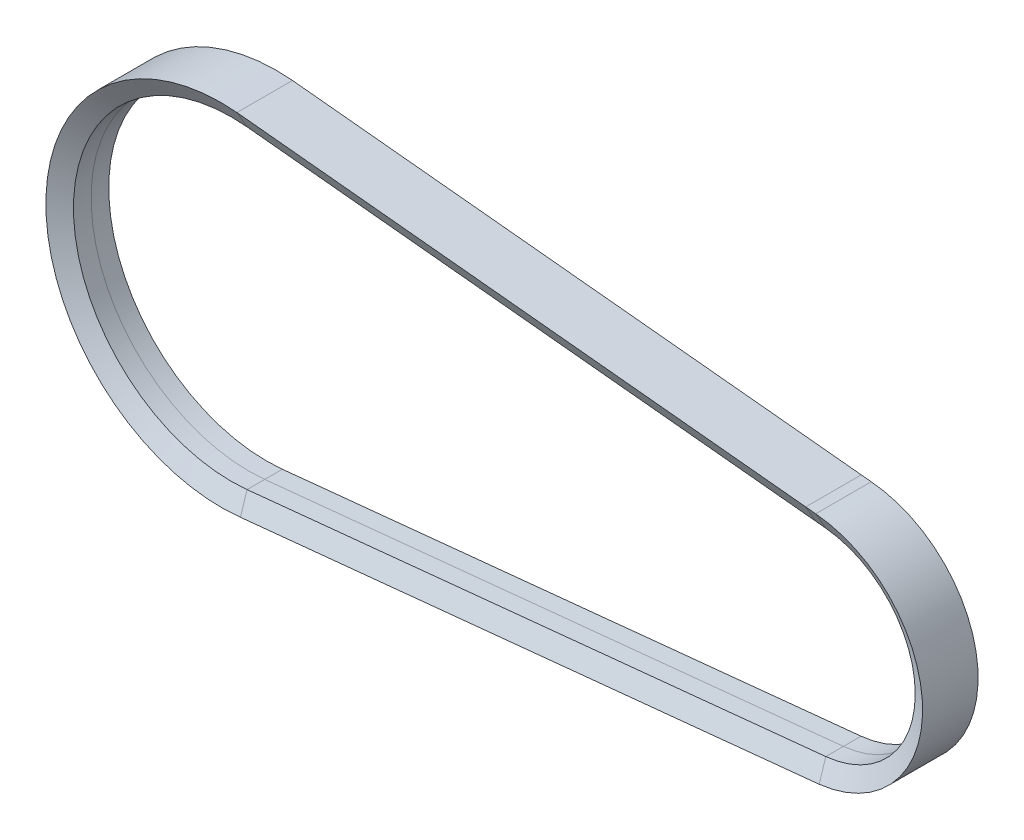
ISO-10303-21;
HEADER;
FILE_DESCRIPTION(('STEP AP214'),'2;1');
FILE_NAME('part.step','',(''),(''),'','','');
FILE_SCHEMA(('AUTOMOTIVE_DESIGN { 1 0 10303 214 1 1 1 1 }'));
ENDSEC;
DATA;
#1=APPLICATION_CONTEXT('core data for automotive mechanical design processes');
#2=APPLICATION_PROTOCOL_DEFINITION('international standard','automotive_design',2000,#1);
#3=PRODUCT_CONTEXT('',#1,'mechanical');
#4=PRODUCT('Part','Part','',(#3));
#5=PRODUCT_RELATED_PRODUCT_CATEGORY('part','',(#4));
#6=PRODUCT_DEFINITION_FORMATION('','',#4);
#7=PRODUCT_DEFINITION_CONTEXT('part definition',#1,'design');
#8=PRODUCT_DEFINITION('design','',#6,#7);
#9=PRODUCT_DEFINITION_SHAPE('','',#8);
#10=(LENGTH_UNIT() NAMED_UNIT(*) SI_UNIT(.MILLI.,.METRE.));
#11=(NAMED_UNIT(*) PLANE_ANGLE_UNIT() SI_UNIT($,.RADIAN.));
#12=(NAMED_UNIT(*) SI_UNIT($,.STERADIAN.) SOLID_ANGLE_UNIT());
#13=UNCERTAINTY_MEASURE_WITH_UNIT(LENGTH_MEASURE(1.E-05),#10,'distance_accuracy_value','');
#14=(GEOMETRIC_REPRESENTATION_CONTEXT(3) GLOBAL_UNCERTAINTY_ASSIGNED_CONTEXT((#13)) GLOBAL_UNIT_ASSIGNED_CONTEXT((#10,
#11,#12)) REPRESENTATION_CONTEXT('',''));
#15=CARTESIAN_POINT('',(0.,0.,0.));
#16=DIRECTION('',(0.,0.,1.));
#17=DIRECTION('',(1.,0.,0.));
#18=AXIS2_PLACEMENT_3D('',#15,#16,#17);
#19=CARTESIAN_POINT('',(-194.6,59.7293216037575,9.49910161513779));
#20=DIRECTION('',(-0.05018856132285,-0.499369880026909,0.864934003976172));
#21=DIRECTION('',(0.,-0.866025403784436,-0.500000000000004));
#22=AXIS2_PLACEMENT_3D('',#19,#20,#21);
#23=PLANE('',#22);
#24=DIRECTION('',(0.99498743710662,-0.1,0.));
#25=VECTOR('',#24,1.);
#26=CARTESIAN_POINT('',(-194.6,59.7293216037575,9.49910161513779));
#27=LINE('',#26,#25);
#28=CARTESIAN_POINT('',(-194.6,59.7293216037575,9.49910161513779));
#29=VERTEX_POINT('',#28);
#30=CARTESIAN_POINT('',(0.,40.1712857188132,9.49910161513779));
#31=VERTEX_POINT('',#30);
#32=EDGE_CURVE('E11',#29,#31,#27,.T.);
#33=ORIENTED_EDGE('',*,*,#32,.F.);
#34=DIRECTION('',(0.,-0.866025403784436,-0.500000000000004));
#35=VECTOR('',#34,1.);
#36=CARTESIAN_POINT('',(-194.6,59.7293216037575,9.49910161513779));
#37=LINE('',#36,#35);
#38=CARTESIAN_POINT('',(-194.6,53.7293216037575,6.035));
#39=VERTEX_POINT('',#38);
#40=EDGE_CURVE('E38',#29,#39,#37,.T.);
#41=ORIENTED_EDGE('',*,*,#40,.T.);
#42=DIRECTION('',(0.99498743710662,-0.1,0.));
#43=VECTOR('',#42,1.);
#44=CARTESIAN_POINT('',(-194.6,53.7293216037575,6.035));
#45=LINE('',#44,#43);
#46=CARTESIAN_POINT('',(0.,34.1712857188132,6.035));
#47=VERTEX_POINT('',#46);
#48=EDGE_CURVE('E163',#39,#47,#45,.T.);
#49=ORIENTED_EDGE('',*,*,#48,.T.);
#50=DIRECTION('',(0.,-0.866025403784436,-0.500000000000004));
#51=VECTOR('',#50,1.);
#52=CARTESIAN_POINT('',(0.,40.1712857188132,9.49910161513779));
#53=LINE('',#52,#51);
#54=EDGE_CURVE('E166',#31,#47,#53,.T.);
#55=ORIENTED_EDGE('',*,*,#54,.F.);
#56=EDGE_LOOP('',(#33,#41,#49,#55));
#57=FACE_BOUND('',#56,.T.);
#58=ADVANCED_FACE('F35',(#57),#23,.T.);
#59=CARTESIAN_POINT('',(-194.6,59.7293216037575,-9.4991016151378));
#60=DIRECTION('',(0.1,0.99498743710662,0.));
#61=DIRECTION('',(-0.99498743710662,0.1,0.));
#62=AXIS2_PLACEMENT_3D('',#59,#60,#61);
#63=PLANE('',#62);
#64=DIRECTION('',(0.99498743710662,-0.1,0.));
#65=VECTOR('',#64,1.);
#66=CARTESIAN_POINT('',(-194.6,59.7293216037575,-9.4991016151378));
#67=LINE('',#66,#65);
#68=CARTESIAN_POINT('',(-194.6,59.7293216037575,-9.4991016151378));
#69=VERTEX_POINT('',#68);
#70=CARTESIAN_POINT('',(0.,40.1712857188132,-9.4991016151378));
#71=VERTEX_POINT('',#70);
#72=EDGE_CURVE('E43',#69,#71,#67,.T.);
#73=ORIENTED_EDGE('',*,*,#72,.F.);
#74=DIRECTION('',(0.,0.,1.));
#75=VECTOR('',#74,1.);
#76=CARTESIAN_POINT('',(-194.6,59.7293216037575,-9.4991016151378));
#77=LINE('',#76,#75);
#78=EDGE_CURVE('E268',#69,#29,#77,.T.);
#79=ORIENTED_EDGE('',*,*,#78,.T.);
#80=ORIENTED_EDGE('',*,*,#32,.T.);
#81=DIRECTION('',(0.,0.,1.));
#82=VECTOR('',#81,1.);
#83=CARTESIAN_POINT('',(0.,40.1712857188132,-9.4991016151378));
#84=LINE('',#83,#82);
#85=EDGE_CURVE('E191',#71,#31,#84,.T.);
#86=ORIENTED_EDGE('',*,*,#85,.F.);
#87=EDGE_LOOP('',(#73,#79,#80,#86));
#88=FACE_BOUND('',#87,.T.);
#89=ADVANCED_FACE('F329',(#88),#63,.T.);
#90=CARTESIAN_POINT('',(-194.6,53.7293216037575,-6.035));
#91=DIRECTION('',(-0.0501885613228501,-0.49936988002691,-0.864934003976171));
#92=DIRECTION('',(0.,0.866025403784436,-0.500000000000005));
#93=AXIS2_PLACEMENT_3D('',#90,#91,#92);
#94=PLANE('',#93);
#95=DIRECTION('',(0.99498743710662,-0.1,0.));
#96=VECTOR('',#95,1.);
#97=CARTESIAN_POINT('',(-194.6,53.7293216037575,-6.035));
#98=LINE('',#97,#96);
#99=CARTESIAN_POINT('',(-194.6,53.7293216037575,-6.035));
#100=VERTEX_POINT('',#99);
#101=CARTESIAN_POINT('',(0.,34.1712857188132,-6.035));
#102=VERTEX_POINT('',#101);
#103=EDGE_CURVE('E232',#100,#102,#98,.T.);
#104=ORIENTED_EDGE('',*,*,#103,.F.);
#105=DIRECTION('',(0.,0.866025403784436,-0.500000000000005));
#106=VECTOR('',#105,1.);
#107=CARTESIAN_POINT('',(-194.6,53.7293216037575,-6.035));
#108=LINE('',#107,#106);
#109=EDGE_CURVE('E248',#100,#69,#108,.T.);
#110=ORIENTED_EDGE('',*,*,#109,.T.);
#111=ORIENTED_EDGE('',*,*,#72,.T.);
#112=DIRECTION('',(0.,0.866025403784436,-0.500000000000005));
#113=VECTOR('',#112,1.);
#114=CARTESIAN_POINT('',(0.,34.1712857188132,-6.035));
#115=LINE('',#114,#113);
#116=EDGE_CURVE('E199',#102,#71,#115,.T.);
#117=ORIENTED_EDGE('',*,*,#116,.F.);
#118=EDGE_LOOP('',(#104,#110,#111,#117));
#119=FACE_BOUND('',#118,.T.);
#120=ADVANCED_FACE('F333',(#119),#94,.T.);
#121=CARTESIAN_POINT('',(-194.6,53.7293216037575,0.));
#122=DIRECTION('',(-0.1,-0.99498743710662,0.));
#123=DIRECTION('',(0.99498743710662,-0.1,0.));
#124=AXIS2_PLACEMENT_3D('',#121,#122,#123);
#125=PLANE('',#124);
#126=DIRECTION('',(0.99498743710662,-0.1,0.));
#127=VECTOR('',#126,1.);
#128=CARTESIAN_POINT('',(-194.6,53.7293216037575,0.));
#129=LINE('',#128,#127);
#130=CARTESIAN_POINT('',(-194.6,53.7293216037575,0.));
#131=VERTEX_POINT('',#130);
#132=CARTESIAN_POINT('',(0.,34.1712857188132,0.));
#133=VERTEX_POINT('',#132);
#134=EDGE_CURVE('E172',#131,#133,#129,.T.);
#135=ORIENTED_EDGE('',*,*,#134,.F.);
#136=DIRECTION('',(0.,0.,-1.));
#137=VECTOR('',#136,1.);
#138=CARTESIAN_POINT('',(-194.6,53.7293216037575,0.));
#139=LINE('',#138,#137);
#140=EDGE_CURVE('E226',#131,#100,#139,.T.);
#141=ORIENTED_EDGE('',*,*,#140,.T.);
#142=ORIENTED_EDGE('',*,*,#103,.T.);
#143=DIRECTION('',(0.,0.,-1.));
#144=VECTOR('',#143,1.);
#145=CARTESIAN_POINT('',(0.,34.1712857188132,0.));
#146=LINE('',#145,#144);
#147=EDGE_CURVE('E196',#133,#102,#146,.T.);
#148=ORIENTED_EDGE('',*,*,#147,.F.);
#149=EDGE_LOOP('',(#135,#141,#142,#148));
#150=FACE_BOUND('',#149,.T.);
#151=ADVANCED_FACE('F339',(#150),#125,.T.);
#152=CARTESIAN_POINT('',(-193.406015075472,-59.6093216037575,9.49910161513779));
#153=CARTESIAN_POINT('',(-231.163690227293,-63.7860767493929,9.49910161513779));
#154=CARTESIAN_POINT('',(-259.589873240044,-38.5860879449783,9.49910161513779));
#155=CARTESIAN_POINT('',(-259.96992462264,-0.599999999999934,9.49910161513779));
#156=CARTESIAN_POINT('',(-260.349976005235,37.3860879449784,9.49910161513779));
#157=CARTESIAN_POINT('',(-232.43368542834,63.1497840471178,9.49910161513779));
#158=CARTESIAN_POINT('',(-194.6,59.7293216037575,9.49910161513779));
#159=CARTESIAN_POINT('',(-194.6,-53.7293216037575,6.035));
#160=CARTESIAN_POINT('',(-228.633171602384,-57.1497840471177,6.035));
#161=CARTESIAN_POINT('',(-254.,-34.2046244336022,6.035));
#162=CARTESIAN_POINT('',(-254.,0.,6.035));
#163=CARTESIAN_POINT('',(-254.,34.2046244336024,6.035));
#164=CARTESIAN_POINT('',(-228.633171602384,57.1497840471178,6.035));
#165=CARTESIAN_POINT('',(-194.6,53.7293216037575,6.035));
#166=(BOUNDED_SURFACE() B_SPLINE_SURFACE(1,3,((#152,#153,#154,#155,#156,#157,#158),(#159,#160,
#161,#162,#163,#164,#165)),.UNSPECIFIED.,.F.,.F.,.F.) B_SPLINE_SURFACE_WITH_KNOTS((2,2),(4,3,4),
(0.,1.),(0.,0.5,1.),
.UNSPECIFIED.) GEOMETRIC_REPRESENTATION_ITEM() RATIONAL_B_SPLINE_SURFACE(((1.,0.780546928833291,
0.780546928833291,1.,0.780546928833291,0.780546928833291,1.),(1.,0.780546928833291,
0.780546928833291,1.,0.780546928833291,0.780546928833291,1.))) REPRESENTATION_ITEM('') SURFACE());
#167=CARTESIAN_POINT('',(-200.,0.,9.49910161513779));
#168=DIRECTION('',(0.,0.,-1.));
#169=DIRECTION('',(0.109949361463616,-0.993937190125082,0.));
#170=AXIS2_PLACEMENT_3D('',#167,#168,#169);
#171=CIRCLE('',#170,59.9729260520536);
#172=CARTESIAN_POINT('',(-193.406015075472,-59.6093216037575,9.49910161513779));
#173=VERTEX_POINT('',#172);
#174=EDGE_CURVE('E51',#173,#29,#171,.T.);
#175=DIRECTION('',(-0.17233687939614,0.848704895708748,-0.500000000000004));
#176=VECTOR('',#175,1.);
#177=CARTESIAN_POINT('',(-193.406015075472,-59.6093216037575,9.49910161513779));
#178=LINE('',#177,#176);
#179=CARTESIAN_POINT('',(-194.6,-53.7293216037575,6.035));
#180=VERTEX_POINT('',#179);
#181=EDGE_CURVE('E231',#173,#180,#178,.T.);
#182=CARTESIAN_POINT('',(-200.,0.,6.035));
#183=DIRECTION('',(0.,0.,-1.));
#184=DIRECTION('',(0.0999999999999998,-0.99498743710662,0.));
#185=AXIS2_PLACEMENT_3D('',#182,#183,#184);
#186=CIRCLE('',#185,54.);
#187=EDGE_CURVE('E229',#180,#39,#186,.T.);
#188=ORIENTED_EDGE('',*,*,#40,.F.);
#189=ORIENTED_EDGE('',*,*,#174,.F.);
#190=ORIENTED_EDGE('',*,*,#181,.T.);
#191=ORIENTED_EDGE('',*,*,#187,.T.);
#192=EDGE_LOOP('',(#188,#189,#190,#191));
#193=FACE_BOUND('',#192,.T.);
#194=ADVANCED_FACE('F290',(#193),#166,.T.);
#195=CARTESIAN_POINT('',(-200.,0.,0.));
#196=DIRECTION('',(0.,0.,-1.));
#197=DIRECTION('',(-1.,0.,0.));
#198=AXIS2_PLACEMENT_3D('',#195,#196,#197);
#199=CYLINDRICAL_SURFACE('',#198,59.9729260520536);
#200=ORIENTED_EDGE('',*,*,#174,.T.);
#201=ORIENTED_EDGE('',*,*,#78,.F.);
#202=CARTESIAN_POINT('',(-200.,0.,-9.4991016151378));
#203=DIRECTION('',(0.,0.,-1.));
#204=DIRECTION('',(0.109949361463616,-0.993937190125082,0.));
#205=AXIS2_PLACEMENT_3D('',#202,#203,#204);
#206=CIRCLE('',#205,59.9729260520536);
#207=CARTESIAN_POINT('',(-193.406015075472,-59.6093216037575,-9.4991016151378));
#208=VERTEX_POINT('',#207);
#209=EDGE_CURVE('E60',#208,#69,#206,.T.);
#210=ORIENTED_EDGE('',*,*,#209,.F.);
#211=DIRECTION('',(0.,0.,1.));
#212=VECTOR('',#211,1.);
#213=CARTESIAN_POINT('',(-193.406015075472,-59.6093216037575,-9.4991016151378));
#214=LINE('',#213,#212);
#215=EDGE_CURVE('E265',#208,#173,#214,.T.);
#216=ORIENTED_EDGE('',*,*,#215,.T.);
#217=EDGE_LOOP('',(#200,#201,#210,#216));
#218=FACE_BOUND('',#217,.T.);
#219=ADVANCED_FACE('F314',(#218),#199,.T.);
#220=CARTESIAN_POINT('',(-194.6,-53.7293216037575,-6.035));
#221=CARTESIAN_POINT('',(-228.633171602384,-57.1497840471177,-6.035));
#222=CARTESIAN_POINT('',(-254.,-34.2046244336022,-6.035));
#223=CARTESIAN_POINT('',(-254.,0.,-6.035));
#224=CARTESIAN_POINT('',(-254.,34.2046244336024,-6.035));
#225=CARTESIAN_POINT('',(-228.633171602384,57.1497840471178,-6.035));
#226=CARTESIAN_POINT('',(-194.6,53.7293216037575,-6.035));
#227=CARTESIAN_POINT('',(-193.406015075472,-59.6093216037575,-9.4991016151378));
#228=CARTESIAN_POINT('',(-231.163690227293,-63.7860767493929,-9.4991016151378));
#229=CARTESIAN_POINT('',(-259.589873240044,-38.5860879449783,-9.4991016151378));
#230=CARTESIAN_POINT('',(-259.96992462264,-0.599999999999934,-9.4991016151378));
#231=CARTESIAN_POINT('',(-260.349976005235,37.3860879449784,-9.4991016151378));
#232=CARTESIAN_POINT('',(-232.43368542834,63.1497840471178,-9.4991016151378));
#233=CARTESIAN_POINT('',(-194.6,59.7293216037575,-9.4991016151378));
#234=(BOUNDED_SURFACE() B_SPLINE_SURFACE(1,3,((#220,#221,#222,#223,#224,#225,#226),(#227,#228,
#229,#230,#231,#232,#233)),.UNSPECIFIED.,.F.,.F.,.F.) B_SPLINE_SURFACE_WITH_KNOTS((2,2),(4,3,4),
(0.,1.),(0.,0.5,1.),
.UNSPECIFIED.) GEOMETRIC_REPRESENTATION_ITEM() RATIONAL_B_SPLINE_SURFACE(((1.,0.780546928833291,
0.780546928833291,1.,0.780546928833291,0.780546928833291,1.),(1.,0.780546928833291,
0.780546928833291,1.,0.780546928833291,0.780546928833291,1.))) REPRESENTATION_ITEM('') SURFACE());
#235=CARTESIAN_POINT('',(-200.,0.,-6.035));
#236=DIRECTION('',(0.,0.,-1.));
#237=DIRECTION('',(0.0999999999999998,-0.99498743710662,0.));
#238=AXIS2_PLACEMENT_3D('',#235,#236,#237);
#239=CIRCLE('',#238,54.);
#240=CARTESIAN_POINT('',(-194.6,-53.7293216037575,-6.035));
#241=VERTEX_POINT('',#240);
#242=EDGE_CURVE('E95',#241,#100,#239,.T.);
#243=DIRECTION('',(0.17233687939614,-0.848704895708747,-0.500000000000005));
#244=VECTOR('',#243,1.);
#245=CARTESIAN_POINT('',(-194.6,-53.7293216037575,-6.035));
#246=LINE('',#245,#244);
#247=EDGE_CURVE('E245',#241,#208,#246,.T.);
#248=ORIENTED_EDGE('',*,*,#209,.T.);
#249=ORIENTED_EDGE('',*,*,#109,.F.);
#250=ORIENTED_EDGE('',*,*,#242,.F.);
#251=ORIENTED_EDGE('',*,*,#247,.T.);
#252=EDGE_LOOP('',(#248,#249,#250,#251));
#253=FACE_BOUND('',#252,.T.);
#254=ADVANCED_FACE('F311',(#253),#234,.T.);
#255=CARTESIAN_POINT('',(-200.,0.,0.));
#256=DIRECTION('',(0.,0.,-1.));
#257=DIRECTION('',(-1.,0.,0.));
#258=AXIS2_PLACEMENT_3D('',#255,#256,#257);
#259=CYLINDRICAL_SURFACE('',#258,54.);
#260=ORIENTED_EDGE('',*,*,#242,.T.);
#261=ORIENTED_EDGE('',*,*,#140,.F.);
#262=CARTESIAN_POINT('',(-200.,0.,0.));
#263=DIRECTION('',(0.,0.,-1.));
#264=DIRECTION('',(0.0999999999999998,-0.99498743710662,0.));
#265=AXIS2_PLACEMENT_3D('',#262,#263,#264);
#266=CIRCLE('',#265,54.);
#267=CARTESIAN_POINT('',(-194.6,-53.7293216037575,0.));
#268=VERTEX_POINT('',#267);
#269=EDGE_CURVE('E227',#268,#131,#266,.T.);
#270=ORIENTED_EDGE('',*,*,#269,.F.);
#271=DIRECTION('',(0.,0.,-1.));
#272=VECTOR('',#271,1.);
#273=CARTESIAN_POINT('',(-194.6,-53.7293216037575,0.));
#274=LINE('',#273,#272);
#275=EDGE_CURVE('E220',#268,#241,#274,.T.);
#276=ORIENTED_EDGE('',*,*,#275,.T.);
#277=EDGE_LOOP('',(#260,#261,#270,#276));
#278=FACE_BOUND('',#277,.T.);
#279=ADVANCED_FACE('F313',(#278),#259,.F.);
#280=CARTESIAN_POINT('',(-200.,0.,0.));
#281=DIRECTION('',(0.,0.,-1.));
#282=DIRECTION('',(-1.,0.,0.));
#283=AXIS2_PLACEMENT_3D('',#280,#281,#282);
#284=CYLINDRICAL_SURFACE('',#283,54.);
#285=ORIENTED_EDGE('',*,*,#269,.T.);
#286=DIRECTION('',(0.,0.,-1.));
#287=VECTOR('',#286,1.);
#288=CARTESIAN_POINT('',(-194.6,53.7293216037575,6.035));
#289=LINE('',#288,#287);
#290=EDGE_CURVE('E224',#39,#131,#289,.T.);
#291=ORIENTED_EDGE('',*,*,#290,.F.);
#292=ORIENTED_EDGE('',*,*,#187,.F.);
#293=DIRECTION('',(0.,0.,-1.));
#294=VECTOR('',#293,1.);
#295=CARTESIAN_POINT('',(-194.6,-53.7293216037575,6.035));
#296=LINE('',#295,#294);
#297=EDGE_CURVE('E215',#180,#268,#296,.T.);
#298=ORIENTED_EDGE('',*,*,#297,.T.);
#299=EDGE_LOOP('',(#285,#291,#292,#298));
#300=FACE_BOUND('',#299,.T.);
#301=ADVANCED_FACE('F320',(#300),#284,.F.);
#302=CARTESIAN_POINT('',(4.59398492452778,-39.7095728616251,9.49910161513779));
#303=DIRECTION('',(-0.05018856132285,0.499369880026909,0.864934003976172));
#304=DIRECTION('',(0.,-0.866025403784436,0.500000000000004));
#305=AXIS2_PLACEMENT_3D('',#302,#303,#304);
#306=PLANE('',#305);
#307=ORIENTED_EDGE('',*,*,#181,.F.);
#308=DIRECTION('',(-0.99498743710662,-0.0999999999999999,0.));
#309=VECTOR('',#308,1.);
#310=CARTESIAN_POINT('',(4.59398492452778,-39.7095728616251,9.49910161513779));
#311=LINE('',#310,#309);
#312=CARTESIAN_POINT('',(4.59398492452778,-39.7095728616251,9.49910161513779));
#313=VERTEX_POINT('',#312);
#314=EDGE_CURVE('E280',#313,#173,#311,.T.);
#315=ORIENTED_EDGE('',*,*,#314,.F.);
#316=DIRECTION('',(-0.172336879396141,0.848704895708748,-0.500000000000004));
#317=VECTOR('',#316,1.);
#318=CARTESIAN_POINT('',(4.59398492452778,-39.7095728616251,9.49910161513779));
#319=LINE('',#318,#317);
#320=CARTESIAN_POINT('',(3.39999999999983,-33.8295728616251,6.035));
#321=VERTEX_POINT('',#320);
#322=EDGE_CURVE('E223',#313,#321,#319,.T.);
#323=ORIENTED_EDGE('',*,*,#322,.T.);
#324=DIRECTION('',(-0.99498743710662,-0.0999999999999999,0.));
#325=VECTOR('',#324,1.);
#326=CARTESIAN_POINT('',(3.39999999999983,-33.8295728616251,6.035));
#327=LINE('',#326,#325);
#328=EDGE_CURVE('E218',#321,#180,#327,.T.);
#329=ORIENTED_EDGE('',*,*,#328,.T.);
#330=EDGE_LOOP('',(#307,#315,#323,#329));
#331=FACE_BOUND('',#330,.T.);
#332=ADVANCED_FACE('F295',(#331),#306,.T.);
#333=CARTESIAN_POINT('',(4.59398492452778,-39.7095728616251,-9.4991016151378));
#334=DIRECTION('',(0.1,-0.99498743710662,0.));
#335=DIRECTION('',(0.99498743710662,0.1,0.));
#336=AXIS2_PLACEMENT_3D('',#333,#334,#335);
#337=PLANE('',#336);
#338=ORIENTED_EDGE('',*,*,#314,.T.);
#339=ORIENTED_EDGE('',*,*,#215,.F.);
#340=DIRECTION('',(-0.99498743710662,-0.0999999999999999,0.));
#341=VECTOR('',#340,1.);
#342=CARTESIAN_POINT('',(4.59398492452778,-39.7095728616251,-9.4991016151378));
#343=LINE('',#342,#341);
#344=CARTESIAN_POINT('',(4.59398492452778,-39.7095728616251,-9.4991016151378));
#345=VERTEX_POINT('',#344);
#346=EDGE_CURVE('E112',#345,#208,#343,.T.);
#347=ORIENTED_EDGE('',*,*,#346,.F.);
#348=DIRECTION('',(0.,0.,1.));
#349=VECTOR('',#348,1.);
#350=CARTESIAN_POINT('',(4.59398492452778,-39.7095728616251,-9.4991016151378));
#351=LINE('',#350,#349);
#352=EDGE_CURVE('E262',#345,#313,#351,.T.);
#353=ORIENTED_EDGE('',*,*,#352,.T.);
#354=EDGE_LOOP('',(#338,#339,#347,#353));
#355=FACE_BOUND('',#354,.T.);
#356=ADVANCED_FACE('F355',(#355),#337,.T.);
#357=CARTESIAN_POINT('',(3.39999999999983,-33.8295728616251,-6.035));
#358=DIRECTION('',(-0.05018856132285,0.49936988002691,-0.864934003976171));
#359=DIRECTION('',(0.,0.866025403784436,0.500000000000005));
#360=AXIS2_PLACEMENT_3D('',#357,#358,#359);
#361=PLANE('',#360);
#362=ORIENTED_EDGE('',*,*,#346,.T.);
#363=ORIENTED_EDGE('',*,*,#247,.F.);
#364=DIRECTION('',(-0.99498743710662,-0.0999999999999999,0.));
#365=VECTOR('',#364,1.);
#366=CARTESIAN_POINT('',(3.39999999999983,-33.8295728616251,-6.035));
#367=LINE('',#366,#365);
#368=CARTESIAN_POINT('',(3.39999999999984,-33.8295728616251,-6.035));
#369=VERTEX_POINT('',#368);
#370=EDGE_CURVE('E119',#369,#241,#367,.T.);
#371=ORIENTED_EDGE('',*,*,#370,.F.);
#372=DIRECTION('',(0.17233687939614,-0.848704895708747,-0.500000000000005));
#373=VECTOR('',#372,1.);
#374=CARTESIAN_POINT('',(3.39999999999984,-33.8295728616251,-6.035));
#375=LINE('',#374,#373);
#376=EDGE_CURVE('E241',#369,#345,#375,.T.);
#377=ORIENTED_EDGE('',*,*,#376,.T.);
#378=EDGE_LOOP('',(#362,#363,#371,#377));
#379=FACE_BOUND('',#378,.T.);
#380=ADVANCED_FACE('F310',(#379),#361,.T.);
#381=CARTESIAN_POINT('',(3.39999999999983,-33.8295728616251,0.));
#382=DIRECTION('',(-0.1,0.99498743710662,0.));
#383=DIRECTION('',(-0.99498743710662,-0.1,0.));
#384=AXIS2_PLACEMENT_3D('',#381,#382,#383);
#385=PLANE('',#384);
#386=ORIENTED_EDGE('',*,*,#370,.T.);
#387=ORIENTED_EDGE('',*,*,#275,.F.);
#388=DIRECTION('',(-0.99498743710662,-0.0999999999999999,0.));
#389=VECTOR('',#388,1.);
#390=CARTESIAN_POINT('',(3.39999999999983,-33.8295728616251,0.));
#391=LINE('',#390,#389);
#392=CARTESIAN_POINT('',(3.39999999999983,-33.8295728616251,0.));
#393=VERTEX_POINT('',#392);
#394=EDGE_CURVE('E127',#393,#268,#391,.T.);
#395=ORIENTED_EDGE('',*,*,#394,.F.);
#396=DIRECTION('',(0.,0.,-1.));
#397=VECTOR('',#396,1.);
#398=CARTESIAN_POINT('',(3.39999999999984,-33.8295728616251,0.));
#399=LINE('',#398,#397);
#400=EDGE_CURVE('E211',#393,#369,#399,.T.);
#401=ORIENTED_EDGE('',*,*,#400,.T.);
#402=EDGE_LOOP('',(#386,#387,#395,#401));
#403=FACE_BOUND('',#402,.T.);
#404=ADVANCED_FACE('F388',(#403),#385,.T.);
#405=CARTESIAN_POINT('',(3.39999999999983,-33.8295728616251,6.035));
#406=DIRECTION('',(-0.1,0.99498743710662,0.));
#407=DIRECTION('',(-0.99498743710662,-0.1,0.));
#408=AXIS2_PLACEMENT_3D('',#405,#406,#407);
#409=PLANE('',#408);
#410=ORIENTED_EDGE('',*,*,#394,.T.);
#411=ORIENTED_EDGE('',*,*,#297,.F.);
#412=ORIENTED_EDGE('',*,*,#328,.F.);
#413=DIRECTION('',(0.,0.,-1.));
#414=VECTOR('',#413,1.);
#415=CARTESIAN_POINT('',(3.39999999999984,-33.8295728616251,6.035));
#416=LINE('',#415,#414);
#417=EDGE_CURVE('E206',#321,#393,#416,.T.);
#418=ORIENTED_EDGE('',*,*,#417,.T.);
#419=EDGE_LOOP('',(#410,#411,#412,#418));
#420=FACE_BOUND('',#419,.T.);
#421=ADVANCED_FACE('F293',(#420),#409,.T.);
#422=CARTESIAN_POINT('',(3.40000000000017,39.8295728616251,9.49910161513779));
#423=CARTESIAN_POINT('',(69.4498743710664,34.1913107180206,9.49910161513779));
#424=CARTESIAN_POINT('',(70.4448618081727,-32.0913107180213,9.49910161513779));
#425=CARTESIAN_POINT('',(4.59398492452771,-39.7095728616251,9.49910161513779));
#426=CARTESIAN_POINT('',(3.40000000000017,33.8295728616251,6.035));
#427=CARTESIAN_POINT('',(59.5000000000002,28.1913107180206,6.035));
#428=CARTESIAN_POINT('',(59.4999999999999,-28.1913107180213,6.035));
#429=CARTESIAN_POINT('',(3.39999999999978,-33.8295728616251,6.035));
#430=(BOUNDED_SURFACE() B_SPLINE_SURFACE(1,3,((#422,#423,#424,#425),(#426,#427,#428,#429)),
.UNSPECIFIED.,.F.,.F.,.F.) B_SPLINE_SURFACE_WITH_KNOTS((2,2),(4,4),(0.,1.),(0.,1.),
.UNSPECIFIED.) GEOMETRIC_REPRESENTATION_ITEM() RATIONAL_B_SPLINE_SURFACE(((1.,0.399999999999999,
0.399999999999999,1.),(1.,0.399999999999999,0.399999999999999,1.))) REPRESENTATION_ITEM('') SURFACE());
#431=CARTESIAN_POINT('',(0.,0.,9.49910161513779));
#432=DIRECTION('',(0.,0.,-1.));
#433=DIRECTION('',(0.0850543757834062,0.996376311019132,0.));
#434=AXIS2_PLACEMENT_3D('',#431,#432,#433);
#435=CIRCLE('',#434,39.9744277549973);
#436=CARTESIAN_POINT('',(3.40000000000004,39.8295728616251,9.49910161513779));
#437=VERTEX_POINT('',#436);
#438=EDGE_CURVE('E276',#437,#313,#435,.T.);
#439=DIRECTION('',(0.,-0.866025403784436,-0.500000000000004));
#440=VECTOR('',#439,1.);
#441=CARTESIAN_POINT('',(3.40000000000004,39.8295728616251,9.49910161513779));
#442=LINE('',#441,#440);
#443=CARTESIAN_POINT('',(3.40000000000004,33.8295728616251,6.035));
#444=VERTEX_POINT('',#443);
#445=EDGE_CURVE('E214',#437,#444,#442,.T.);
#446=CARTESIAN_POINT('',(0.,0.,6.035));
#447=DIRECTION('',(0.,0.,-1.));
#448=DIRECTION('',(0.100000000000005,0.99498743710662,0.));
#449=AXIS2_PLACEMENT_3D('',#446,#447,#448);
#450=CIRCLE('',#449,34.);
#451=EDGE_CURVE('E209',#444,#321,#450,.T.);
#452=ORIENTED_EDGE('',*,*,#322,.F.);
#453=ORIENTED_EDGE('',*,*,#438,.F.);
#454=ORIENTED_EDGE('',*,*,#445,.T.);
#455=ORIENTED_EDGE('',*,*,#451,.T.);
#456=EDGE_LOOP('',(#452,#453,#454,#455));
#457=FACE_BOUND('',#456,.T.);
#458=ADVANCED_FACE('F301',(#457),#430,.T.);
#459=CARTESIAN_POINT('',(0.,0.,0.));
#460=DIRECTION('',(0.,0.,-1.));
#461=DIRECTION('',(-1.,0.,0.));
#462=AXIS2_PLACEMENT_3D('',#459,#460,#461);
#463=CYLINDRICAL_SURFACE('',#462,39.9744277549973);
#464=ORIENTED_EDGE('',*,*,#438,.T.);
#465=ORIENTED_EDGE('',*,*,#352,.F.);
#466=CARTESIAN_POINT('',(0.,0.,-9.4991016151378));
#467=DIRECTION('',(0.,0.,-1.));
#468=DIRECTION('',(0.0850543757834062,0.996376311019132,0.));
#469=AXIS2_PLACEMENT_3D('',#466,#467,#468);
#470=CIRCLE('',#469,39.9744277549973);
#471=CARTESIAN_POINT('',(3.40000000000004,39.8295728616251,-9.4991016151378));
#472=VERTEX_POINT('',#471);
#473=EDGE_CURVE('E259',#472,#345,#470,.T.);
#474=ORIENTED_EDGE('',*,*,#473,.F.);
#475=DIRECTION('',(0.,0.,1.));
#476=VECTOR('',#475,1.);
#477=CARTESIAN_POINT('',(3.40000000000004,39.8295728616251,-9.4991016151378));
#478=LINE('',#477,#476);
#479=EDGE_CURVE('E257',#472,#437,#478,.T.);
#480=ORIENTED_EDGE('',*,*,#479,.T.);
#481=EDGE_LOOP('',(#464,#465,#474,#480));
#482=FACE_BOUND('',#481,.T.);
#483=ADVANCED_FACE('F308',(#482),#463,.T.);
#484=CARTESIAN_POINT('',(3.40000000000017,33.8295728616251,-6.035));
#485=CARTESIAN_POINT('',(59.5000000000002,28.1913107180206,-6.035));
#486=CARTESIAN_POINT('',(59.4999999999999,-28.1913107180213,-6.035));
#487=CARTESIAN_POINT('',(3.39999999999978,-33.8295728616251,-6.035));
#488=CARTESIAN_POINT('',(3.40000000000017,39.8295728616251,-9.4991016151378));
#489=CARTESIAN_POINT('',(69.4498743710664,34.1913107180206,-9.4991016151378));
#490=CARTESIAN_POINT('',(70.4448618081727,-32.0913107180213,-9.4991016151378));
#491=CARTESIAN_POINT('',(4.59398492452771,-39.7095728616251,-9.4991016151378));
#492=(BOUNDED_SURFACE() B_SPLINE_SURFACE(1,3,((#484,#485,#486,#487),(#488,#489,#490,#491)),
.UNSPECIFIED.,.F.,.F.,.F.) B_SPLINE_SURFACE_WITH_KNOTS((2,2),(4,4),(0.,1.),(0.,1.),
.UNSPECIFIED.) GEOMETRIC_REPRESENTATION_ITEM() RATIONAL_B_SPLINE_SURFACE(((1.,0.399999999999999,
0.399999999999999,1.),(1.,0.399999999999999,0.399999999999999,1.))) REPRESENTATION_ITEM('') SURFACE());
#493=CARTESIAN_POINT('',(0.,0.,-6.035));
#494=DIRECTION('',(0.,0.,-1.));
#495=DIRECTION('',(0.100000000000005,0.99498743710662,0.));
#496=AXIS2_PLACEMENT_3D('',#493,#494,#495);
#497=CIRCLE('',#496,34.);
#498=CARTESIAN_POINT('',(3.40000000000004,33.8295728616251,-6.035));
#499=VERTEX_POINT('',#498);
#500=EDGE_CURVE('E144',#499,#369,#497,.T.);
#501=DIRECTION('',(0.,0.866025403784436,-0.500000000000005));
#502=VECTOR('',#501,1.);
#503=CARTESIAN_POINT('',(3.40000000000004,33.8295728616251,-6.035));
#504=LINE('',#503,#502);
#505=EDGE_CURVE('E238',#499,#472,#504,.T.);
#506=ORIENTED_EDGE('',*,*,#473,.T.);
#507=ORIENTED_EDGE('',*,*,#376,.F.);
#508=ORIENTED_EDGE('',*,*,#500,.F.);
#509=ORIENTED_EDGE('',*,*,#505,.T.);
#510=EDGE_LOOP('',(#506,#507,#508,#509));
#511=FACE_BOUND('',#510,.T.);
#512=ADVANCED_FACE('F309',(#511),#492,.T.);
#513=CARTESIAN_POINT('',(0.,0.,0.));
#514=DIRECTION('',(0.,0.,-1.));
#515=DIRECTION('',(-1.,0.,0.));
#516=AXIS2_PLACEMENT_3D('',#513,#514,#515);
#517=CYLINDRICAL_SURFACE('',#516,34.);
#518=ORIENTED_EDGE('',*,*,#500,.T.);
#519=ORIENTED_EDGE('',*,*,#400,.F.);
#520=CARTESIAN_POINT('',(0.,0.,0.));
#521=DIRECTION('',(0.,0.,-1.));
#522=DIRECTION('',(0.100000000000005,0.99498743710662,0.));
#523=AXIS2_PLACEMENT_3D('',#520,#521,#522);
#524=CIRCLE('',#523,34.);
#525=CARTESIAN_POINT('',(3.40000000000004,33.8295728616251,0.));
#526=VERTEX_POINT('',#525);
#527=EDGE_CURVE('E150',#526,#393,#524,.T.);
#528=ORIENTED_EDGE('',*,*,#527,.F.);
#529=DIRECTION('',(0.,0.,-1.));
#530=VECTOR('',#529,1.);
#531=CARTESIAN_POINT('',(3.40000000000004,33.8295728616251,0.));
#532=LINE('',#531,#530);
#533=EDGE_CURVE('E204',#526,#499,#532,.T.);
#534=ORIENTED_EDGE('',*,*,#533,.T.);
#535=EDGE_LOOP('',(#518,#519,#528,#534));
#536=FACE_BOUND('',#535,.T.);
#537=ADVANCED_FACE('F381',(#536),#517,.F.);
#538=CARTESIAN_POINT('',(0.,0.,0.));
#539=DIRECTION('',(0.,0.,-1.));
#540=DIRECTION('',(-1.,0.,0.));
#541=AXIS2_PLACEMENT_3D('',#538,#539,#540);
#542=CYLINDRICAL_SURFACE('',#541,34.);
#543=ORIENTED_EDGE('',*,*,#527,.T.);
#544=ORIENTED_EDGE('',*,*,#417,.F.);
#545=ORIENTED_EDGE('',*,*,#451,.F.);
#546=DIRECTION('',(0.,0.,-1.));
#547=VECTOR('',#546,1.);
#548=CARTESIAN_POINT('',(3.40000000000004,33.8295728616251,6.035));
#549=LINE('',#548,#547);
#550=EDGE_CURVE('E183',#444,#526,#549,.T.);
#551=ORIENTED_EDGE('',*,*,#550,.T.);
#552=EDGE_LOOP('',(#543,#544,#545,#551));
#553=FACE_BOUND('',#552,.T.);
#554=ADVANCED_FACE('F300',(#553),#542,.F.);
#555=CARTESIAN_POINT('',(0.,40.1712857188132,9.49910161513779));
#556=DIRECTION('',(-0.05018856132285,-0.499369880026909,0.864934003976172));
#557=DIRECTION('',(0.,-0.866025403784436,-0.500000000000004));
#558=AXIS2_PLACEMENT_3D('',#555,#556,#557);
#559=PLANE('',#558);
#560=ORIENTED_EDGE('',*,*,#445,.F.);
#561=DIRECTION('',(0.99498743710662,-0.1,0.));
#562=VECTOR('',#561,1.);
#563=CARTESIAN_POINT('',(0.,40.1712857188132,9.49910161513779));
#564=LINE('',#563,#562);
#565=EDGE_CURVE('E190',#31,#437,#564,.T.);
#566=ORIENTED_EDGE('',*,*,#565,.F.);
#567=ORIENTED_EDGE('',*,*,#54,.T.);
#568=DIRECTION('',(0.99498743710662,-0.1,0.));
#569=VECTOR('',#568,1.);
#570=CARTESIAN_POINT('',(0.,34.1712857188132,6.035));
#571=LINE('',#570,#569);
#572=EDGE_CURVE('E178',#47,#444,#571,.T.);
#573=ORIENTED_EDGE('',*,*,#572,.T.);
#574=EDGE_LOOP('',(#560,#566,#567,#573));
#575=FACE_BOUND('',#574,.T.);
#576=ADVANCED_FACE('F188',(#575),#559,.T.);
#577=CARTESIAN_POINT('',(0.,40.1712857188132,-9.4991016151378));
#578=DIRECTION('',(0.1,0.99498743710662,0.));
#579=DIRECTION('',(-0.99498743710662,0.1,0.));
#580=AXIS2_PLACEMENT_3D('',#577,#578,#579);
#581=PLANE('',#580);
#582=ORIENTED_EDGE('',*,*,#565,.T.);
#583=ORIENTED_EDGE('',*,*,#479,.F.);
#584=DIRECTION('',(0.99498743710662,-0.1,0.));
#585=VECTOR('',#584,1.);
#586=CARTESIAN_POINT('',(0.,40.1712857188132,-9.4991016151378));
#587=LINE('',#586,#585);
#588=EDGE_CURVE('E254',#71,#472,#587,.T.);
#589=ORIENTED_EDGE('',*,*,#588,.F.);
#590=ORIENTED_EDGE('',*,*,#85,.T.);
#591=EDGE_LOOP('',(#582,#583,#589,#590));
#592=FACE_BOUND('',#591,.T.);
#593=ADVANCED_FACE('F304',(#592),#581,.T.);
#594=CARTESIAN_POINT('',(0.,34.1712857188132,-6.035));
#595=DIRECTION('',(-0.0501885613228501,-0.49936988002691,-0.864934003976172));
#596=DIRECTION('',(0.,0.866025403784436,-0.500000000000005));
#597=AXIS2_PLACEMENT_3D('',#594,#595,#596);
#598=PLANE('',#597);
#599=ORIENTED_EDGE('',*,*,#588,.T.);
#600=ORIENTED_EDGE('',*,*,#505,.F.);
#601=DIRECTION('',(0.99498743710662,-0.1,0.));
#602=VECTOR('',#601,1.);
#603=CARTESIAN_POINT('',(0.,34.1712857188132,-6.035));
#604=LINE('',#603,#602);
#605=EDGE_CURVE('E235',#102,#499,#604,.T.);
#606=ORIENTED_EDGE('',*,*,#605,.F.);
#607=ORIENTED_EDGE('',*,*,#116,.T.);
#608=EDGE_LOOP('',(#599,#600,#606,#607));
#609=FACE_BOUND('',#608,.T.);
#610=ADVANCED_FACE('F373',(#609),#598,.T.);
#611=CARTESIAN_POINT('',(0.,34.1712857188132,0.));
#612=DIRECTION('',(-0.1,-0.99498743710662,0.));
#613=DIRECTION('',(0.99498743710662,-0.1,0.));
#614=AXIS2_PLACEMENT_3D('',#611,#612,#613);
#615=PLANE('',#614);
#616=ORIENTED_EDGE('',*,*,#605,.T.);
#617=ORIENTED_EDGE('',*,*,#533,.F.);
#618=DIRECTION('',(0.99498743710662,-0.1,0.));
#619=VECTOR('',#618,1.);
#620=CARTESIAN_POINT('',(0.,34.1712857188132,0.));
#621=LINE('',#620,#619);
#622=EDGE_CURVE('E203',#133,#526,#621,.T.);
#623=ORIENTED_EDGE('',*,*,#622,.F.);
#624=ORIENTED_EDGE('',*,*,#147,.T.);
#625=EDGE_LOOP('',(#616,#617,#623,#624));
#626=FACE_BOUND('',#625,.T.);
#627=ADVANCED_FACE('F376',(#626),#615,.T.);
#628=CARTESIAN_POINT('',(0.,34.1712857188132,6.035));
#629=DIRECTION('',(-0.1,-0.99498743710662,0.));
#630=DIRECTION('',(0.99498743710662,-0.1,0.));
#631=AXIS2_PLACEMENT_3D('',#628,#629,#630);
#632=PLANE('',#631);
#633=ORIENTED_EDGE('',*,*,#622,.T.);
#634=ORIENTED_EDGE('',*,*,#550,.F.);
#635=ORIENTED_EDGE('',*,*,#572,.F.);
#636=DIRECTION('',(0.,0.,-1.));
#637=VECTOR('',#636,1.);
#638=CARTESIAN_POINT('',(0.,34.1712857188132,6.035));
#639=LINE('',#638,#637);
#640=EDGE_CURVE('E181',#47,#133,#639,.T.);
#641=ORIENTED_EDGE('',*,*,#640,.T.);
#642=EDGE_LOOP('',(#633,#634,#635,#641));
#643=FACE_BOUND('',#642,.T.);
#644=ADVANCED_FACE('F180',(#643),#632,.T.);
#645=CARTESIAN_POINT('',(-194.6,53.7293216037575,6.035));
#646=DIRECTION('',(-0.1,-0.99498743710662,0.));
#647=DIRECTION('',(0.99498743710662,-0.1,0.));
#648=AXIS2_PLACEMENT_3D('',#645,#646,#647);
#649=PLANE('',#648);
#650=ORIENTED_EDGE('',*,*,#290,.T.);
#651=ORIENTED_EDGE('',*,*,#134,.T.);
#652=ORIENTED_EDGE('',*,*,#640,.F.);
#653=ORIENTED_EDGE('',*,*,#48,.F.);
#654=EDGE_LOOP('',(#650,#651,#652,#653));
#655=FACE_BOUND('',#654,.T.);
#656=ADVANCED_FACE('F193',(#655),#649,.T.);
#657=CLOSED_SHELL('',(#58,#89,#120,#151,#194,#219,#254,#279,#301,#332,#356,#380,#404,#421,#458,
#483,#512,#537,#554,#576,#593,#610,#627,#644,#656));
#658=MANIFOLD_SOLID_BREP('B2',#657);
#659=ADVANCED_BREP_SHAPE_REPRESENTATION('',(#18,#658),#14);
#660=SHAPE_DEFINITION_REPRESENTATION(#9,#659);
ENDSEC;
END-ISO-10303-21;
